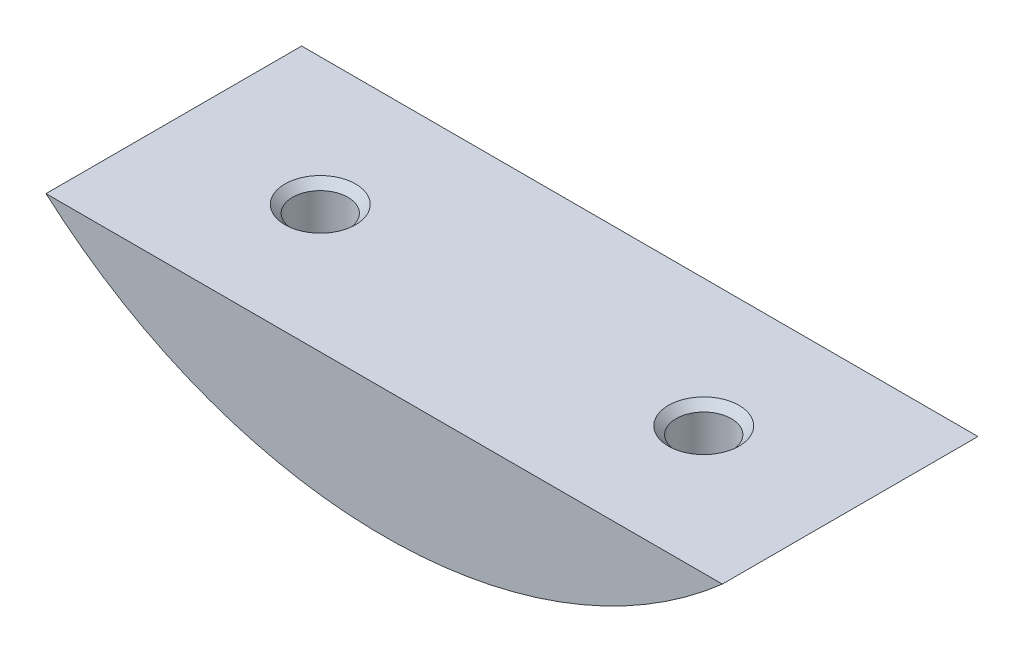
ISO-10303-21;
HEADER;
FILE_DESCRIPTION(('STEP AP214'),'2;1');
FILE_NAME('part.step','',(''),(''),'','','');
FILE_SCHEMA(('AUTOMOTIVE_DESIGN { 1 0 10303 214 1 1 1 1 }'));
ENDSEC;
DATA;
#1=APPLICATION_CONTEXT('core data for automotive mechanical design processes');
#2=APPLICATION_PROTOCOL_DEFINITION('international standard','automotive_design',2000,#1);
#3=PRODUCT_CONTEXT('',#1,'mechanical');
#4=PRODUCT('Part','Part','',(#3));
#5=PRODUCT_RELATED_PRODUCT_CATEGORY('part','',(#4));
#6=PRODUCT_DEFINITION_FORMATION('','',#4);
#7=PRODUCT_DEFINITION_CONTEXT('part definition',#1,'design');
#8=PRODUCT_DEFINITION('design','',#6,#7);
#9=PRODUCT_DEFINITION_SHAPE('','',#8);
#10=(LENGTH_UNIT() NAMED_UNIT(*) SI_UNIT(.MILLI.,.METRE.));
#11=(NAMED_UNIT(*) PLANE_ANGLE_UNIT() SI_UNIT($,.RADIAN.));
#12=(NAMED_UNIT(*) SI_UNIT($,.STERADIAN.) SOLID_ANGLE_UNIT());
#13=UNCERTAINTY_MEASURE_WITH_UNIT(LENGTH_MEASURE(1.E-05),#10,'distance_accuracy_value','');
#14=(GEOMETRIC_REPRESENTATION_CONTEXT(3) GLOBAL_UNCERTAINTY_ASSIGNED_CONTEXT((#13)) GLOBAL_UNIT_ASSIGNED_CONTEXT((#10,
#11,#12)) REPRESENTATION_CONTEXT('',''));
#15=CARTESIAN_POINT('',(0.,0.,0.));
#16=DIRECTION('',(0.,0.,1.));
#17=DIRECTION('',(1.,0.,0.));
#18=AXIS2_PLACEMENT_3D('',#15,#16,#17);
#19=CARTESIAN_POINT('',(33.6010416505203,38.1,25.4));
#20=DIRECTION('',(0.,0.,-1.));
#21=DIRECTION('',(-1.,0.,0.));
#22=AXIS2_PLACEMENT_3D('',#19,#20,#21);
#23=CYLINDRICAL_SURFACE('',#22,50.8);
#24=CARTESIAN_POINT('',(14.5510416505203,-8.99286039305744,15.45));
#25=CARTESIAN_POINT('',(14.7125099649259,-9.05817624323932,15.4499944763793));
#26=CARTESIAN_POINT('',(14.8744262876394,-9.12269985170647,15.4357500243657));
#27=CARTESIAN_POINT('',(15.1946231610348,-9.24842574726098,15.3785806389362));
#28=CARTESIAN_POINT('',(15.3528996887726,-9.30962445246395,15.3356254131366));
#29=CARTESIAN_POINT('',(15.6612213100838,-9.42715126949529,15.2213225094917));
#30=CARTESIAN_POINT('',(15.8112507515971,-9.4834702293743,15.1499228299184));
#31=CARTESIAN_POINT('',(16.097619492635,-9.58955382314837,14.9799764368829));
#32=CARTESIAN_POINT('',(16.2339648499389,-9.63932136034733,14.8814418087083));
#33=CARTESIAN_POINT('',(16.4818979002032,-9.72877283085568,14.6647202510579));
#34=CARTESIAN_POINT('',(16.5943453787265,-9.76881956359347,14.5476682764316));
#35=CARTESIAN_POINT('',(16.7978221141319,-9.84062461122368,14.2940141097286));
#36=CARTESIAN_POINT('',(16.8888589626346,-9.87238586435684,14.1574188748681));
#37=CARTESIAN_POINT('',(17.0408002571891,-9.92504023950548,13.8778447991985));
#38=CARTESIAN_POINT('',(17.1032344752522,-9.94648932831256,13.7358011509191));
#39=CARTESIAN_POINT('',(17.203494446404,-9.98079951469922,13.4423057008741));
#40=CARTESIAN_POINT('',(17.2413276594239,-9.99366321571598,13.290856766413));
#41=CARTESIAN_POINT('',(17.289737164338,-10.0101025785543,12.9901694101223));
#42=CARTESIAN_POINT('',(17.3014577789996,-10.0140682352907,12.8411355149092));
#43=CARTESIAN_POINT('',(17.3006030883825,-10.0137787602131,12.5431555061139));
#44=CARTESIAN_POINT('',(17.2880310789364,-10.0095247435798,12.3942093833659));
#45=CARTESIAN_POINT('',(17.2394758991559,-9.99303272155428,12.1031370460692));
#46=CARTESIAN_POINT('',(17.2038735061016,-9.98092456524807,11.9609395885327));
#47=CARTESIAN_POINT('',(17.1109251498733,-9.94912541245909,11.6847518215762));
#48=CARTESIAN_POINT('',(17.0535786984146,-9.92943424569202,11.5507616965385));
#49=CARTESIAN_POINT('',(16.9182198107322,-9.88258673568552,11.2927020238318));
#50=CARTESIAN_POINT('',(16.8399350773489,-9.85533183838629,11.1687934914981));
#51=CARTESIAN_POINT('',(16.665720912991,-9.79408540820064,10.9359754736045));
#52=CARTESIAN_POINT('',(16.5697888383383,-9.76009286591519,10.8270682396102));
#53=CARTESIAN_POINT('',(16.359156337265,-9.68462481218623,10.6225949619969));
#54=CARTESIAN_POINT('',(16.2438605149628,-9.64290516287327,10.5277331543833));
#55=CARTESIAN_POINT('',(16.0009815252041,-9.55390444538292,10.3586133901736));
#56=CARTESIAN_POINT('',(15.8733953618736,-9.50662202060741,10.2843604743752));
#57=CARTESIAN_POINT('',(15.6018792570975,-9.40465598224387,10.1539832108954));
#58=CARTESIAN_POINT('',(15.4574312363966,-9.34970295813399,10.0991490642777));
#59=CARTESIAN_POINT('',(15.162814454927,-9.23599826893969,10.0145305738803));
#60=CARTESIAN_POINT('',(15.0126440268142,-9.17724549318671,9.98475359027885));
#61=CARTESIAN_POINT('',(14.7013621519928,-9.05370369372814,9.94938579349431));
#62=CARTESIAN_POINT('',(14.5401333820506,-8.98876379539161,9.94534753691223));
#63=CARTESIAN_POINT('',(14.2198304028183,-8.85783873293359,9.9653032989917));
#64=CARTESIAN_POINT('',(14.0607567957707,-8.79185328737992,9.98930499615598));
#65=CARTESIAN_POINT('',(13.7429951755733,-8.658194912534,10.0661303091586));
#66=CARTESIAN_POINT('',(13.5845470509031,-8.59055195360832,10.1200047860462));
#67=CARTESIAN_POINT('',(13.278925503176,-8.45834339110643,10.256189691875));
#68=CARTESIAN_POINT('',(13.131753200683,-8.39377809362101,10.3385029425255));
#69=CARTESIAN_POINT('',(12.8550160806995,-8.2709509106004,10.5288573501049));
#70=CARTESIAN_POINT('',(12.7252613976522,-8.21262275969975,10.636578374498));
#71=CARTESIAN_POINT('',(12.4860430723256,-8.10404867384348,10.8760265955572));
#72=CARTESIAN_POINT('',(12.3765706766489,-8.05379925352623,11.0077433872618));
#73=CARTESIAN_POINT('',(12.1895940223043,-7.96733983761984,11.281695513297));
#74=CARTESIAN_POINT('',(12.1103720762344,-7.93038643427165,11.4225204025381));
#75=CARTESIAN_POINT('',(11.9772523000295,-7.86800176732478,11.7180102403361));
#76=CARTESIAN_POINT('',(11.9233347587196,-7.84256153595381,11.8726643043074));
#77=CARTESIAN_POINT('',(11.8474810957203,-7.80669009312685,12.1753636421034));
#78=CARTESIAN_POINT('',(11.8229794190299,-7.79505610405642,12.3226263199263));
#79=CARTESIAN_POINT('',(11.7981866178449,-7.78328366406883,12.6196117719317));
#80=CARTESIAN_POINT('',(11.7978857509381,-7.78314058730626,12.7693335318938));
#81=CARTESIAN_POINT('',(11.8207992566597,-7.79402104271571,13.0577672131983));
#82=CARTESIAN_POINT('',(11.8426536863515,-7.80439878368595,13.1966148319056));
#83=CARTESIAN_POINT('',(11.906875565657,-7.83478428471337,13.468361512692));
#84=CARTESIAN_POINT('',(11.949243409563,-7.85479222987449,13.6012604603768));
#85=CARTESIAN_POINT('',(12.0535389782816,-7.90378757982248,13.8595971875822));
#86=CARTESIAN_POINT('',(12.1157357010111,-7.93289836261178,13.9849023488804));
#87=CARTESIAN_POINT('',(12.2572453428479,-7.9986814559049,14.2232272506711));
#88=CARTESIAN_POINT('',(12.3365620930806,-8.0353554588266,14.3362442327845));
#89=CARTESIAN_POINT('',(12.51609083132,-8.11769424673767,14.555522849122));
#90=CARTESIAN_POINT('',(12.6173933615186,-8.16381517781269,14.660718846081));
#91=CARTESIAN_POINT('',(12.8338500594021,-8.261383171789,14.8528402205955));
#92=CARTESIAN_POINT('',(12.9490127504602,-8.31283350929724,14.9397542643841));
#93=CARTESIAN_POINT('',(13.2011688078291,-8.42425005629452,15.1009832064));
#94=CARTESIAN_POINT('',(13.3391947901179,-8.48456543550124,15.1734416110547));
#95=CARTESIAN_POINT('',(13.6244316214159,-8.6075917226562,15.2938063752384));
#96=CARTESIAN_POINT('',(13.771635618688,-8.6703008303486,15.3417308098446));
#97=CARTESIAN_POINT('',(14.0246379223001,-8.77661422773207,15.4012247212832));
#98=CARTESIAN_POINT('',(14.1289827673289,-8.82005794805623,15.4194771893182));
#99=CARTESIAN_POINT('',(14.339167840361,-8.90673513095845,15.4438669642786));
#100=CARTESIAN_POINT('',(14.4450081475446,-8.94996858223922,15.450003627268));
#101=CARTESIAN_POINT('',(14.5510416505203,-8.99286039305744,15.45));
#102=B_SPLINE_CURVE_WITH_KNOTS('',3,(#24,#25,#26,#27,#28,#29,#30,#31,#32,#33,#34,#35,#36,#37,
#38,#39,#40,#41,#42,#43,#44,#45,#46,#47,#48,#49,#50,#51,#52,#53,#54,#55,#56,#57,#58,#59,#60,#61,
#62,#63,#64,#65,#66,#67,#68,#69,#70,#71,#72,#73,#74,#75,#76,#77,#78,#79,#80,#81,#82,#83,#84,#85,
#86,#87,#88,#89,#90,#91,#92,#93,#94,#95,#96,#97,#98,#99,#100,#101),.UNSPECIFIED.,.T.,.F.,(4,2,2,
2,2,2,2,2,2,2,2,2,2,2,2,2,2,2,2,2,2,2,2,2,2,2,2,2,2,2,2,2,2,2,2,2,2,2,4),(0.,0.522138941871746,
1.04482965757082,1.56848036634751,2.09189822917689,2.59083078335619,3.08958616215689,
3.55711319290256,4.02449838602983,4.47096145563465,4.91736395688637,5.35656815423125,
5.79578221493352,6.24101204821021,6.68630863399741,7.14934305761279,7.61249063675736,
8.1023093053962,8.59227180099675,9.11152946142081,9.63092934947371,10.1698796205265,
10.7088833818585,11.2414279597783,11.7737421648334,12.2682685426481,12.7624090610974,
13.2092891526175,13.6559893447066,14.0768366450927,14.4976920349859,14.9245187720867,
15.3514411238234,15.8089788455147,16.2667993838847,16.7661241246389,17.2650804631701,
17.6079420268476,17.9508218125844),.UNSPECIFIED.);
#103=CARTESIAN_POINT('',(14.5510416505203,-8.99286039305744,15.45));
#104=VERTEX_POINT('',#103);
#105=EDGE_CURVE('E86',#104,#104,#102,.T.);
#106=ORIENTED_EDGE('',*,*,#105,.T.);
#107=EDGE_LOOP('',(#106));
#108=FACE_BOUND('',#107,.T.);
#109=CARTESIAN_POINT('',(52.6510416505203,-8.99286039305745,15.45));
#110=CARTESIAN_POINT('',(52.8172590249158,-8.92562061334896,15.4499940116637));
#111=CARTESIAN_POINT('',(52.98325603639,-8.85743803195401,15.4348962821638));
#112=CARTESIAN_POINT('',(53.3100936071888,-8.72119970637987,15.3750382104632));
#113=CARTESIAN_POINT('',(53.4709255975749,-8.65314433325737,15.3302310007145));
#114=CARTESIAN_POINT('',(53.7828225819766,-8.51935772411895,15.2118506978572));
#115=CARTESIAN_POINT('',(53.9338830387595,-8.45362757410589,15.1382643518454));
#116=CARTESIAN_POINT('',(54.2214971002199,-8.32694823661818,14.963724287568));
#117=CARTESIAN_POINT('',(54.3580563584143,-8.26599718837924,14.8627812896426));
#118=CARTESIAN_POINT('',(54.6081691623056,-8.15320405841928,14.6389363314696));
#119=CARTESIAN_POINT('',(54.7222851619407,-8.10114533669349,14.516774921169));
#120=CARTESIAN_POINT('',(54.9278279539195,-8.00662662666633,14.2514051187056));
#121=CARTESIAN_POINT('',(55.0192674240318,-7.96416127618641,14.1082085582977));
#122=CARTESIAN_POINT('',(55.1683826224616,-7.89452163154047,13.8179443493491));
#123=CARTESIAN_POINT('',(55.2282796132444,-7.86634909639345,13.6722590378629));
#124=CARTESIAN_POINT('',(55.3225370129242,-7.82188366079167,13.3711516074761));
#125=CARTESIAN_POINT('',(55.3569155587147,-7.80558232319812,13.2157364892587));
#126=CARTESIAN_POINT('',(55.396473620416,-7.78681258395954,12.9146481031502));
#127=CARTESIAN_POINT('',(55.4039895300539,-7.78323744111581,12.7693466474118));
#128=CARTESIAN_POINT('',(55.3960174190897,-7.78702491938129,12.4795389355902));
#129=CARTESIAN_POINT('',(55.3805348961185,-7.79438492651175,12.3350324977502));
#130=CARTESIAN_POINT('',(55.3282202157254,-7.81917349915541,12.0560456549722));
#131=CARTESIAN_POINT('',(55.2921377681764,-7.83624843044517,11.9213913716857));
#132=CARTESIAN_POINT('',(55.2006945932434,-7.87931633321907,11.6603335682574));
#133=CARTESIAN_POINT('',(55.145331617559,-7.90531034475103,11.5339310123908));
#134=CARTESIAN_POINT('',(55.0149392096818,-7.96615173639848,11.2876895715487));
#135=CARTESIAN_POINT('',(54.9392507336625,-8.00129429937763,11.1682739637051));
#136=CARTESIAN_POINT('',(54.7718414759659,-8.07841182070828,10.943772196025));
#137=CARTESIAN_POINT('',(54.6801155317352,-8.12038897885518,10.8386906698617));
#138=CARTESIAN_POINT('',(54.4750602983471,-8.2133783867828,10.6365406850407));
#139=CARTESIAN_POINT('',(54.3605692800248,-8.2648515472103,10.5408634230278));
#140=CARTESIAN_POINT('',(54.1191019271851,-8.37221398512902,10.3699345192469));
#141=CARTESIAN_POINT('',(53.9921207083448,-8.42810498853686,10.2946909117128));
#142=CARTESIAN_POINT('',(53.7174176520284,-8.54756904020753,10.1601783186541));
#143=CARTESIAN_POINT('',(53.5688516097765,-8.61138880033564,10.102848182791));
#144=CARTESIAN_POINT('',(53.2645708883121,-8.74029185511823,10.0146334524996));
#145=CARTESIAN_POINT('',(53.108853983924,-8.80537553938944,9.98375714942632));
#146=CARTESIAN_POINT('',(52.7863596467044,-8.93823378473653,9.94831298837765));
#147=CARTESIAN_POINT('',(52.6194169172358,-9.00598151085724,9.94512744092418));
#148=CARTESIAN_POINT('',(52.28668186206,-9.1389559093148,9.96914596555054));
#149=CARTESIAN_POINT('',(52.1208896000882,-9.20418244287952,9.99635170797806));
#150=CARTESIAN_POINT('',(51.796437630802,-9.32992368672579,10.0808246334509));
#151=CARTESIAN_POINT('',(51.6377412867048,-9.39046417470412,10.137911589838));
#152=CARTESIAN_POINT('',(51.3317186985648,-9.50556500176811,10.281238233759));
#153=CARTESIAN_POINT('',(51.1843894027296,-9.56012694762021,10.3674700628735));
#154=CARTESIAN_POINT('',(50.9135502415336,-9.65915443526115,10.5622350499354));
#155=CARTESIAN_POINT('',(50.7892163310594,-9.70398910619935,10.6694327940173));
#156=CARTESIAN_POINT('',(50.5604397618758,-9.78563035402549,10.905868630868));
#157=CARTESIAN_POINT('',(50.4559889723751,-9.82244021339258,11.0350976732349));
#158=CARTESIAN_POINT('',(50.2772398526858,-9.88492297501171,11.3029289199683));
#159=CARTESIAN_POINT('',(50.201435021347,-9.91115962080441,11.4403948350907));
#160=CARTESIAN_POINT('',(50.0740026955023,-9.95503228737002,11.7273788799709));
#161=CARTESIAN_POINT('',(50.0223670524178,-9.97267120692696,11.8768929277759));
#162=CARTESIAN_POINT('',(49.9473698006103,-9.99822295660936,12.1754628562882));
#163=CARTESIAN_POINT('',(49.9226995897854,-10.0065862591157,12.3241526188227));
#164=CARTESIAN_POINT('',(49.8979930966649,-10.0149618568293,12.623788829222));
#165=CARTESIAN_POINT('',(49.8979524410212,-10.0149756346202,12.7747348716902));
#166=CARTESIAN_POINT('',(49.9222021688918,-10.0067548883937,13.0707653043453));
#167=CARTESIAN_POINT('',(49.9459096187915,-9.99871798077982,13.2159034852066));
#168=CARTESIAN_POINT('',(50.0158996751492,-9.97487690323844,13.4999511910816));
#169=CARTESIAN_POINT('',(50.0621820180124,-9.95907282400399,13.6388607888025));
#170=CARTESIAN_POINT('',(50.1760132356729,-9.91993272304073,13.9075405424517));
#171=CARTESIAN_POINT('',(50.2436912368389,-9.8965509465202,14.0372491909298));
#172=CARTESIAN_POINT('',(50.3978834127965,-9.84280707916389,14.2833088227884));
#173=CARTESIAN_POINT('',(50.4843989981188,-9.81244446560378,14.3996588048946));
#174=CARTESIAN_POINT('',(50.676657612201,-9.74426883041557,14.6199987901156));
#175=CARTESIAN_POINT('',(50.7829478550585,-9.70624021920742,14.7234438797056));
#176=CARTESIAN_POINT('',(51.0093529627623,-9.62426198888844,14.9111076826565));
#177=CARTESIAN_POINT('',(51.1294743461203,-9.58030957625722,14.9953172742277));
#178=CARTESIAN_POINT('',(51.3869093927696,-9.48490042094861,15.1470388318098));
#179=CARTESIAN_POINT('',(51.5248036659982,-9.43316496271744,15.2133879856616));
#180=CARTESIAN_POINT('',(51.808039097469,-9.32539558220603,15.3219885084491));
#181=CARTESIAN_POINT('',(51.9533736637083,-9.26936544379534,15.3642608198201));
#182=CARTESIAN_POINT('',(52.1914022108682,-9.17629503087095,15.412905205004));
#183=CARTESIAN_POINT('',(52.2829895241318,-9.14017985773545,15.4268230911662));
#184=CARTESIAN_POINT('',(52.4667543287532,-9.06709309876837,15.4453721844198));
#185=CARTESIAN_POINT('',(52.5589318247482,-9.03012150620178,15.4500033184534));
#186=CARTESIAN_POINT('',(52.6510416505203,-8.99286039305745,15.45));
#187=B_SPLINE_CURVE_WITH_KNOTS('',3,(#109,#110,#111,#112,#113,#114,#115,#116,#117,#118,#119,
#120,#121,#122,#123,#124,#125,#126,#127,#128,#129,#130,#131,#132,#133,#134,#135,#136,#137,#138,
#139,#140,#141,#142,#143,#144,#145,#146,#147,#148,#149,#150,#151,#152,#153,#154,#155,#156,#157,
#158,#159,#160,#161,#162,#163,#164,#165,#166,#167,#168,#169,#170,#171,#172,#173,#174,#175,#176,
#177,#178,#179,#180,#181,#182,#183,#184,#185,#186),.UNSPECIFIED.,.T.,.F.,(4,2,2,2,2,2,2,2,2,2,2,
2,2,2,2,2,2,2,2,2,2,2,2,2,2,2,2,2,2,2,2,2,2,2,2,2,2,2,4),(0.,0.53754753048096,1.07594508143442,
1.61459085902816,2.15302586020525,2.67548228705309,3.19764596232468,3.67508081285656,
4.1521760071828,4.58660303342834,5.02092622933521,5.44036759734694,5.8598578927602,
6.29506301231998,6.73040848571914,7.20192533567134,7.67362731206879,8.18603470506064,
8.69860264186024,9.236619268798,9.77466546733496,10.3095032446272,10.8441969268988,
11.3520735229544,11.8597419851086,12.334781063707,12.8096598685543,13.2603006434313,
13.7108614002353,14.1506269943551,14.5903874536913,15.0328543034923,15.4753542959609,
15.9326841950334,16.3902305193025,16.8727602783236,17.3548696814956,17.652750814835,
17.9506342915587),.UNSPECIFIED.);
#188=CARTESIAN_POINT('',(52.6510416505203,-8.99286039305745,15.45));
#189=VERTEX_POINT('',#188);
#190=EDGE_CURVE('E90',#189,#189,#187,.T.);
#191=ORIENTED_EDGE('',*,*,#190,.T.);
#192=EDGE_LOOP('',(#191));
#193=FACE_BOUND('',#192,.T.);
#194=CARTESIAN_POINT('',(33.6010416505203,38.1,0.));
#195=DIRECTION('',(0.,0.,1.));
#196=DIRECTION('',(1.,0.,0.));
#197=AXIS2_PLACEMENT_3D('',#194,#195,#196);
#198=CIRCLE('',#197,50.8);
#199=CARTESIAN_POINT('',(0.,0.,0.));
#200=VERTEX_POINT('',#199);
#201=CARTESIAN_POINT('',(67.2020833010406,0.,0.));
#202=VERTEX_POINT('',#201);
#203=EDGE_CURVE('E79',#200,#202,#198,.T.);
#204=ORIENTED_EDGE('',*,*,#203,.T.);
#205=DIRECTION('',(0.,0.,-1.));
#206=VECTOR('',#205,1.);
#207=CARTESIAN_POINT('',(67.2020833010406,0.,25.4));
#208=LINE('',#207,#206);
#209=CARTESIAN_POINT('',(67.2020833010406,0.,25.4));
#210=VERTEX_POINT('',#209);
#211=EDGE_CURVE('E75',#210,#202,#208,.T.);
#212=ORIENTED_EDGE('',*,*,#211,.F.);
#213=CARTESIAN_POINT('',(33.6010416505203,38.1,25.4));
#214=DIRECTION('',(0.,0.,1.));
#215=DIRECTION('',(1.,0.,0.));
#216=AXIS2_PLACEMENT_3D('',#213,#214,#215);
#217=CIRCLE('',#216,50.8);
#218=CARTESIAN_POINT('',(0.,0.,25.4));
#219=VERTEX_POINT('',#218);
#220=EDGE_CURVE('E78',#219,#210,#217,.T.);
#221=ORIENTED_EDGE('',*,*,#220,.F.);
#222=DIRECTION('',(0.,0.,-1.));
#223=VECTOR('',#222,1.);
#224=CARTESIAN_POINT('',(0.,0.,25.4));
#225=LINE('',#224,#223);
#226=EDGE_CURVE('E72',#219,#200,#225,.T.);
#227=ORIENTED_EDGE('',*,*,#226,.T.);
#228=EDGE_LOOP('',(#204,#212,#221,#227));
#229=FACE_BOUND('',#228,.T.);
#230=ADVANCED_FACE('F41',(#108,#193,#229),#23,.T.);
#231=CARTESIAN_POINT('',(0.,0.,25.4));
#232=DIRECTION('',(0.,-1.,0.));
#233=DIRECTION('',(0.,0.,-1.));
#234=AXIS2_PLACEMENT_3D('',#231,#232,#233);
#235=PLANE('',#234);
#236=CARTESIAN_POINT('',(14.5510416505203,0.,12.7));
#237=DIRECTION('',(0.,-1.,0.));
#238=DIRECTION('',(0.,0.,-1.));
#239=AXIS2_PLACEMENT_3D('',#236,#237,#238);
#240=CIRCLE('',#239,3.512);
#241=CARTESIAN_POINT('',(14.5510416505203,0.,9.188));
#242=VERTEX_POINT('',#241);
#243=EDGE_CURVE('E52',#242,#242,#240,.T.);
#244=ORIENTED_EDGE('',*,*,#243,.T.);
#245=EDGE_LOOP('',(#244));
#246=FACE_BOUND('',#245,.T.);
#247=CARTESIAN_POINT('',(52.6510416505203,0.,12.7));
#248=DIRECTION('',(0.,-1.,0.));
#249=DIRECTION('',(0.,0.,-1.));
#250=AXIS2_PLACEMENT_3D('',#247,#248,#249);
#251=CIRCLE('',#250,3.512);
#252=CARTESIAN_POINT('',(52.6510416505203,0.,9.188));
#253=VERTEX_POINT('',#252);
#254=EDGE_CURVE('E101',#253,#253,#251,.T.);
#255=ORIENTED_EDGE('',*,*,#254,.T.);
#256=EDGE_LOOP('',(#255));
#257=FACE_BOUND('',#256,.T.);
#258=DIRECTION('',(-1.,0.,0.));
#259=VECTOR('',#258,1.);
#260=CARTESIAN_POINT('',(0.,0.,0.));
#261=LINE('',#260,#259);
#262=EDGE_CURVE('E67',#202,#200,#261,.T.);
#263=ORIENTED_EDGE('',*,*,#262,.T.);
#264=ORIENTED_EDGE('',*,*,#226,.F.);
#265=DIRECTION('',(-1.,0.,0.));
#266=VECTOR('',#265,1.);
#267=CARTESIAN_POINT('',(0.,0.,25.4));
#268=LINE('',#267,#266);
#269=EDGE_CURVE('E59',#210,#219,#268,.T.);
#270=ORIENTED_EDGE('',*,*,#269,.F.);
#271=ORIENTED_EDGE('',*,*,#211,.T.);
#272=EDGE_LOOP('',(#263,#264,#270,#271));
#273=FACE_BOUND('',#272,.T.);
#274=ADVANCED_FACE('F71',(#246,#257,#273),#235,.F.);
#275=CARTESIAN_POINT('',(33.6010416505203,38.1,25.4));
#276=DIRECTION('',(0.,0.,1.));
#277=DIRECTION('',(1.,0.,0.));
#278=AXIS2_PLACEMENT_3D('',#275,#276,#277);
#279=PLANE('',#278);
#280=ORIENTED_EDGE('',*,*,#220,.T.);
#281=ORIENTED_EDGE('',*,*,#269,.T.);
#282=EDGE_LOOP('',(#280,#281));
#283=FACE_BOUND('',#282,.T.);
#284=ADVANCED_FACE('F144',(#283),#279,.T.);
#285=CARTESIAN_POINT('',(33.6010416505203,38.1,0.));
#286=DIRECTION('',(0.,0.,1.));
#287=DIRECTION('',(1.,0.,0.));
#288=AXIS2_PLACEMENT_3D('',#285,#286,#287);
#289=PLANE('',#288);
#290=ORIENTED_EDGE('',*,*,#203,.F.);
#291=ORIENTED_EDGE('',*,*,#262,.F.);
#292=EDGE_LOOP('',(#290,#291));
#293=FACE_BOUND('',#292,.T.);
#294=ADVANCED_FACE('F84',(#293),#289,.F.);
#295=CARTESIAN_POINT('',(52.6510416505203,-12.7,12.7));
#296=DIRECTION('',(0.,1.,0.));
#297=DIRECTION('',(0.,0.,1.));
#298=AXIS2_PLACEMENT_3D('',#295,#296,#297);
#299=CYLINDRICAL_SURFACE('',#298,2.75);
#300=CARTESIAN_POINT('',(52.6510416505203,-0.762000000000002,12.7));
#301=DIRECTION('',(0.,-1.,0.));
#302=DIRECTION('',(0.,0.,-1.));
#303=AXIS2_PLACEMENT_3D('',#300,#301,#302);
#304=CIRCLE('',#303,2.75);
#305=CARTESIAN_POINT('',(52.6510416505203,-0.762000000000002,9.95));
#306=VERTEX_POINT('',#305);
#307=EDGE_CURVE('E11',#306,#306,#304,.F.);
#308=ORIENTED_EDGE('',*,*,#307,.T.);
#309=EDGE_LOOP('',(#308));
#310=FACE_BOUND('',#309,.T.);
#311=ORIENTED_EDGE('',*,*,#190,.F.);
#312=EDGE_LOOP('',(#311));
#313=FACE_BOUND('',#312,.T.);
#314=ADVANCED_FACE('F118',(#310,#313),#299,.F.);
#315=CARTESIAN_POINT('',(14.5510416505203,-12.7,12.7));
#316=DIRECTION('',(0.,1.,0.));
#317=DIRECTION('',(0.,0.,1.));
#318=AXIS2_PLACEMENT_3D('',#315,#316,#317);
#319=CYLINDRICAL_SURFACE('',#318,2.75);
#320=CARTESIAN_POINT('',(14.5510416505203,-0.762000000000007,12.7));
#321=DIRECTION('',(0.,-1.,0.));
#322=DIRECTION('',(0.,0.,-1.));
#323=AXIS2_PLACEMENT_3D('',#320,#321,#322);
#324=CIRCLE('',#323,2.75);
#325=CARTESIAN_POINT('',(14.5510416505203,-0.762000000000007,9.95));
#326=VERTEX_POINT('',#325);
#327=EDGE_CURVE('E97',#326,#326,#324,.F.);
#328=ORIENTED_EDGE('',*,*,#327,.T.);
#329=EDGE_LOOP('',(#328));
#330=FACE_BOUND('',#329,.T.);
#331=ORIENTED_EDGE('',*,*,#105,.F.);
#332=EDGE_LOOP('',(#331));
#333=FACE_BOUND('',#332,.T.);
#334=ADVANCED_FACE('F113',(#330,#333),#319,.F.);
#335=CARTESIAN_POINT('',(14.5510416505203,-0.762000000000007,12.7));
#336=DIRECTION('',(0.,1.,0.));
#337=DIRECTION('',(0.,0.,1.));
#338=AXIS2_PLACEMENT_3D('',#335,#336,#337);
#339=CONICAL_SURFACE('',#338,2.75,0.785398163397447);
#340=ORIENTED_EDGE('',*,*,#243,.F.);
#341=EDGE_LOOP('',(#340));
#342=FACE_BOUND('',#341,.T.);
#343=ORIENTED_EDGE('',*,*,#327,.F.);
#344=EDGE_LOOP('',(#343));
#345=FACE_BOUND('',#344,.T.);
#346=ADVANCED_FACE('F110',(#342,#345),#339,.F.);
#347=CARTESIAN_POINT('',(52.6510416505203,-0.762000000000002,12.7));
#348=DIRECTION('',(0.,1.,0.));
#349=DIRECTION('',(0.,0.,1.));
#350=AXIS2_PLACEMENT_3D('',#347,#348,#349);
#351=CONICAL_SURFACE('',#350,2.75,0.785398163397447);
#352=ORIENTED_EDGE('',*,*,#254,.F.);
#353=EDGE_LOOP('',(#352));
#354=FACE_BOUND('',#353,.T.);
#355=ORIENTED_EDGE('',*,*,#307,.F.);
#356=EDGE_LOOP('',(#355));
#357=FACE_BOUND('',#356,.T.);
#358=ADVANCED_FACE('F44',(#354,#357),#351,.F.);
#359=CLOSED_SHELL('',(#230,#274,#284,#294,#314,#334,#346,#358));
#360=MANIFOLD_SOLID_BREP('B2',#359);
#361=ADVANCED_BREP_SHAPE_REPRESENTATION('',(#18,#360),#14);
#362=SHAPE_DEFINITION_REPRESENTATION(#9,#361);
ENDSEC;
END-ISO-10303-21;
